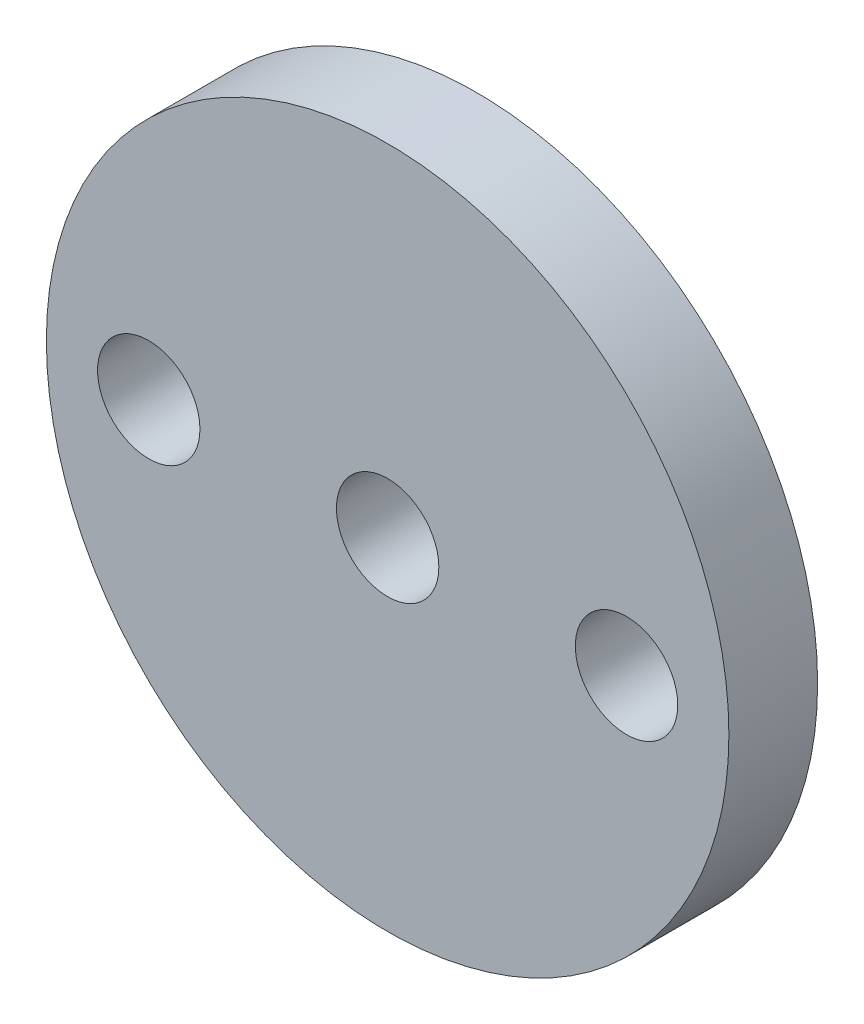
ISO-10303-21;
HEADER;
FILE_DESCRIPTION(('STEP AP214'),'2;1');
FILE_NAME('part.step','',(''),(''),'','','');
FILE_SCHEMA(('AUTOMOTIVE_DESIGN { 1 0 10303 214 1 1 1 1 }'));
ENDSEC;
DATA;
#1=APPLICATION_CONTEXT('core data for automotive mechanical design processes');
#2=APPLICATION_PROTOCOL_DEFINITION('international standard','automotive_design',2000,#1);
#3=PRODUCT_CONTEXT('',#1,'mechanical');
#4=PRODUCT('Part','Part','',(#3));
#5=PRODUCT_RELATED_PRODUCT_CATEGORY('part','',(#4));
#6=PRODUCT_DEFINITION_FORMATION('','',#4);
#7=PRODUCT_DEFINITION_CONTEXT('part definition',#1,'design');
#8=PRODUCT_DEFINITION('design','',#6,#7);
#9=PRODUCT_DEFINITION_SHAPE('','',#8);
#10=(LENGTH_UNIT() NAMED_UNIT(*) SI_UNIT(.MILLI.,.METRE.));
#11=(NAMED_UNIT(*) PLANE_ANGLE_UNIT() SI_UNIT($,.RADIAN.));
#12=(NAMED_UNIT(*) SI_UNIT($,.STERADIAN.) SOLID_ANGLE_UNIT());
#13=UNCERTAINTY_MEASURE_WITH_UNIT(LENGTH_MEASURE(1.E-05),#10,'distance_accuracy_value','');
#14=(GEOMETRIC_REPRESENTATION_CONTEXT(3) GLOBAL_UNCERTAINTY_ASSIGNED_CONTEXT((#13)) GLOBAL_UNIT_ASSIGNED_CONTEXT((#10,
#11,#12)) REPRESENTATION_CONTEXT('',''));
#15=CARTESIAN_POINT('',(0.,0.,0.));
#16=DIRECTION('',(0.,0.,1.));
#17=DIRECTION('',(1.,0.,0.));
#18=AXIS2_PLACEMENT_3D('',#15,#16,#17);
#19=CARTESIAN_POINT('',(0.,0.,2.6));
#20=DIRECTION('',(0.,0.,1.));
#21=DIRECTION('',(1.,0.,0.));
#22=AXIS2_PLACEMENT_3D('',#19,#20,#21);
#23=PLANE('',#22);
#24=CARTESIAN_POINT('',(7.,0.,2.6));
#25=DIRECTION('',(0.,0.,1.));
#26=DIRECTION('',(1.,0.,0.));
#27=AXIS2_PLACEMENT_3D('',#24,#25,#26);
#28=CIRCLE('',#27,1.5);
#29=CARTESIAN_POINT('',(8.5,0.,2.6));
#30=VERTEX_POINT('',#29);
#31=EDGE_CURVE('E56',#30,#30,#28,.T.);
#32=ORIENTED_EDGE('',*,*,#31,.F.);
#33=EDGE_LOOP('',(#32));
#34=FACE_BOUND('',#33,.T.);
#35=CARTESIAN_POINT('',(0.,0.,2.6));
#36=DIRECTION('',(0.,0.,1.));
#37=DIRECTION('',(1.,0.,0.));
#38=AXIS2_PLACEMENT_3D('',#35,#36,#37);
#39=CIRCLE('',#38,10.);
#40=CARTESIAN_POINT('',(10.,0.,2.6));
#41=VERTEX_POINT('',#40);
#42=EDGE_CURVE('E10',#41,#41,#39,.T.);
#43=ORIENTED_EDGE('',*,*,#42,.T.);
#44=EDGE_LOOP('',(#43));
#45=FACE_BOUND('',#44,.T.);
#46=CARTESIAN_POINT('',(0.,0.,2.6));
#47=DIRECTION('',(0.,0.,1.));
#48=DIRECTION('',(1.,0.,0.));
#49=AXIS2_PLACEMENT_3D('',#46,#47,#48);
#50=CIRCLE('',#49,1.5);
#51=CARTESIAN_POINT('',(1.5,0.,2.6));
#52=VERTEX_POINT('',#51);
#53=EDGE_CURVE('E50',#52,#52,#50,.T.);
#54=ORIENTED_EDGE('',*,*,#53,.F.);
#55=EDGE_LOOP('',(#54));
#56=FACE_BOUND('',#55,.T.);
#57=CARTESIAN_POINT('',(-7.,0.,2.6));
#58=DIRECTION('',(0.,0.,1.));
#59=DIRECTION('',(1.,0.,0.));
#60=AXIS2_PLACEMENT_3D('',#57,#58,#59);
#61=CIRCLE('',#60,1.5);
#62=CARTESIAN_POINT('',(-5.5,0.,2.6));
#63=VERTEX_POINT('',#62);
#64=EDGE_CURVE('E64',#63,#63,#61,.T.);
#65=ORIENTED_EDGE('',*,*,#64,.F.);
#66=EDGE_LOOP('',(#65));
#67=FACE_BOUND('',#66,.T.);
#68=ADVANCED_FACE('F37',(#34,#45,#56,#67),#23,.T.);
#69=CARTESIAN_POINT('',(0.,0.,0.));
#70=DIRECTION('',(0.,0.,1.));
#71=DIRECTION('',(1.,0.,0.));
#72=AXIS2_PLACEMENT_3D('',#69,#70,#71);
#73=PLANE('',#72);
#74=CARTESIAN_POINT('',(0.,0.,0.));
#75=DIRECTION('',(0.,0.,1.));
#76=DIRECTION('',(1.,0.,0.));
#77=AXIS2_PLACEMENT_3D('',#74,#75,#76);
#78=CIRCLE('',#77,10.);
#79=CARTESIAN_POINT('',(10.,0.,0.));
#80=VERTEX_POINT('',#79);
#81=EDGE_CURVE('E41',#80,#80,#78,.T.);
#82=ORIENTED_EDGE('',*,*,#81,.F.);
#83=EDGE_LOOP('',(#82));
#84=FACE_BOUND('',#83,.T.);
#85=CARTESIAN_POINT('',(0.,0.,0.));
#86=DIRECTION('',(0.,0.,1.));
#87=DIRECTION('',(1.,0.,0.));
#88=AXIS2_PLACEMENT_3D('',#85,#86,#87);
#89=CIRCLE('',#88,1.5);
#90=CARTESIAN_POINT('',(1.5,0.,0.));
#91=VERTEX_POINT('',#90);
#92=EDGE_CURVE('E52',#91,#91,#89,.T.);
#93=ORIENTED_EDGE('',*,*,#92,.T.);
#94=EDGE_LOOP('',(#93));
#95=FACE_BOUND('',#94,.T.);
#96=CARTESIAN_POINT('',(7.,0.,0.));
#97=DIRECTION('',(0.,0.,1.));
#98=DIRECTION('',(1.,0.,0.));
#99=AXIS2_PLACEMENT_3D('',#96,#97,#98);
#100=CIRCLE('',#99,1.5);
#101=CARTESIAN_POINT('',(8.5,0.,0.));
#102=VERTEX_POINT('',#101);
#103=EDGE_CURVE('E60',#102,#102,#100,.T.);
#104=ORIENTED_EDGE('',*,*,#103,.T.);
#105=EDGE_LOOP('',(#104));
#106=FACE_BOUND('',#105,.T.);
#107=CARTESIAN_POINT('',(-7.,0.,0.));
#108=DIRECTION('',(0.,0.,1.));
#109=DIRECTION('',(1.,0.,0.));
#110=AXIS2_PLACEMENT_3D('',#107,#108,#109);
#111=CIRCLE('',#110,1.5);
#112=CARTESIAN_POINT('',(-5.5,0.,0.));
#113=VERTEX_POINT('',#112);
#114=EDGE_CURVE('E68',#113,#113,#111,.T.);
#115=ORIENTED_EDGE('',*,*,#114,.T.);
#116=EDGE_LOOP('',(#115));
#117=FACE_BOUND('',#116,.T.);
#118=ADVANCED_FACE('F80',(#84,#95,#106,#117),#73,.F.);
#119=CARTESIAN_POINT('',(0.,0.,2.6));
#120=DIRECTION('',(0.,0.,-1.));
#121=DIRECTION('',(-1.,0.,0.));
#122=AXIS2_PLACEMENT_3D('',#119,#120,#121);
#123=CYLINDRICAL_SURFACE('',#122,10.);
#124=ORIENTED_EDGE('',*,*,#42,.F.);
#125=EDGE_LOOP('',(#124));
#126=FACE_BOUND('',#125,.T.);
#127=ORIENTED_EDGE('',*,*,#81,.T.);
#128=EDGE_LOOP('',(#127));
#129=FACE_BOUND('',#128,.T.);
#130=ADVANCED_FACE('F39',(#126,#129),#123,.T.);
#131=CARTESIAN_POINT('',(0.,0.,2.6));
#132=DIRECTION('',(0.,0.,-1.));
#133=DIRECTION('',(-1.,0.,0.));
#134=AXIS2_PLACEMENT_3D('',#131,#132,#133);
#135=CYLINDRICAL_SURFACE('',#134,1.5);
#136=ORIENTED_EDGE('',*,*,#53,.T.);
#137=EDGE_LOOP('',(#136));
#138=FACE_BOUND('',#137,.T.);
#139=ORIENTED_EDGE('',*,*,#92,.F.);
#140=EDGE_LOOP('',(#139));
#141=FACE_BOUND('',#140,.T.);
#142=ADVANCED_FACE('F89',(#138,#141),#135,.F.);
#143=CARTESIAN_POINT('',(7.,0.,2.6));
#144=DIRECTION('',(0.,0.,-1.));
#145=DIRECTION('',(-1.,0.,0.));
#146=AXIS2_PLACEMENT_3D('',#143,#144,#145);
#147=CYLINDRICAL_SURFACE('',#146,1.5);
#148=ORIENTED_EDGE('',*,*,#31,.T.);
#149=EDGE_LOOP('',(#148));
#150=FACE_BOUND('',#149,.T.);
#151=ORIENTED_EDGE('',*,*,#103,.F.);
#152=EDGE_LOOP('',(#151));
#153=FACE_BOUND('',#152,.T.);
#154=ADVANCED_FACE('F92',(#150,#153),#147,.F.);
#155=CARTESIAN_POINT('',(-7.,0.,2.6));
#156=DIRECTION('',(0.,0.,-1.));
#157=DIRECTION('',(-1.,0.,0.));
#158=AXIS2_PLACEMENT_3D('',#155,#156,#157);
#159=CYLINDRICAL_SURFACE('',#158,1.5);
#160=ORIENTED_EDGE('',*,*,#64,.T.);
#161=EDGE_LOOP('',(#160));
#162=FACE_BOUND('',#161,.T.);
#163=ORIENTED_EDGE('',*,*,#114,.F.);
#164=EDGE_LOOP('',(#163));
#165=FACE_BOUND('',#164,.T.);
#166=ADVANCED_FACE('F76',(#162,#165),#159,.F.);
#167=CLOSED_SHELL('',(#68,#118,#130,#142,#154,#166));
#168=MANIFOLD_SOLID_BREP('B2',#167);
#169=ADVANCED_BREP_SHAPE_REPRESENTATION('',(#18,#168),#14);
#170=SHAPE_DEFINITION_REPRESENTATION(#9,#169);
ENDSEC;
END-ISO-10303-21;
